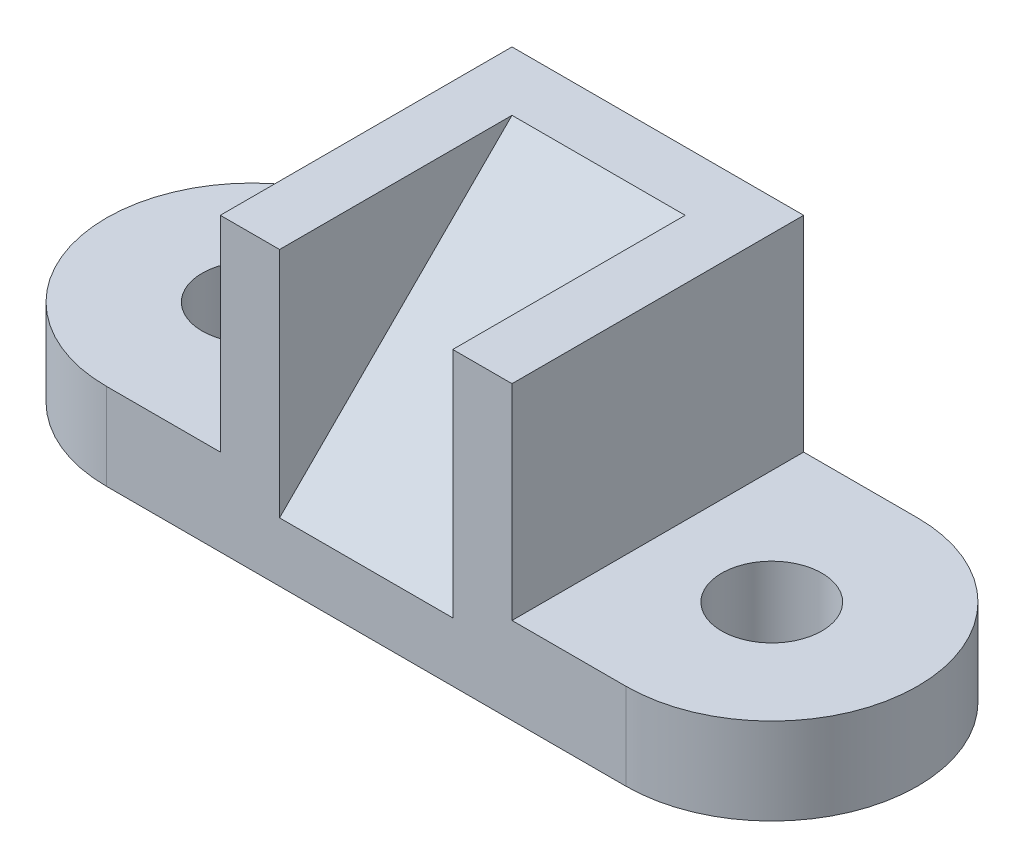
ISO-10303-21;
HEADER;
FILE_DESCRIPTION(('STEP AP214'),'2;1');
FILE_NAME('part.step','',(''),(''),'','','');
FILE_SCHEMA(('AUTOMOTIVE_DESIGN { 1 0 10303 214 1 1 1 1 }'));
ENDSEC;
DATA;
#1=APPLICATION_CONTEXT('core data for automotive mechanical design processes');
#2=APPLICATION_PROTOCOL_DEFINITION('international standard','automotive_design',2000,#1);
#3=PRODUCT_CONTEXT('',#1,'mechanical');
#4=PRODUCT('Part','Part','',(#3));
#5=PRODUCT_RELATED_PRODUCT_CATEGORY('part','',(#4));
#6=PRODUCT_DEFINITION_FORMATION('','',#4);
#7=PRODUCT_DEFINITION_CONTEXT('part definition',#1,'design');
#8=PRODUCT_DEFINITION('design','',#6,#7);
#9=PRODUCT_DEFINITION_SHAPE('','',#8);
#10=(LENGTH_UNIT() NAMED_UNIT(*) SI_UNIT(.MILLI.,.METRE.));
#11=(NAMED_UNIT(*) PLANE_ANGLE_UNIT() SI_UNIT($,.RADIAN.));
#12=(NAMED_UNIT(*) SI_UNIT($,.STERADIAN.) SOLID_ANGLE_UNIT());
#13=UNCERTAINTY_MEASURE_WITH_UNIT(LENGTH_MEASURE(1.E-05),#10,'distance_accuracy_value','');
#14=(GEOMETRIC_REPRESENTATION_CONTEXT(3) GLOBAL_UNCERTAINTY_ASSIGNED_CONTEXT((#13)) GLOBAL_UNIT_ASSIGNED_CONTEXT((#10,
#11,#12)) REPRESENTATION_CONTEXT('',''));
#15=CARTESIAN_POINT('',(0.,0.,0.));
#16=DIRECTION('',(0.,0.,1.));
#17=DIRECTION('',(1.,0.,0.));
#18=AXIS2_PLACEMENT_3D('',#15,#16,#17);
#19=CARTESIAN_POINT('',(0.,19.,32.));
#20=DIRECTION('',(0.,0.,-1.));
#21=DIRECTION('',(-1.,0.,0.));
#22=AXIS2_PLACEMENT_3D('',#19,#20,#21);
#23=PLANE('',#22);
#24=DIRECTION('',(0.,1.,0.));
#25=VECTOR('',#24,1.);
#26=CARTESIAN_POINT('',(76.,13.,32.));
#27=LINE('',#26,#25);
#28=CARTESIAN_POINT('',(76.,13.,32.));
#29=VERTEX_POINT('',#28);
#30=CARTESIAN_POINT('',(76.,64.,32.));
#31=VERTEX_POINT('',#30);
#32=EDGE_CURVE('E122',#29,#31,#27,.T.);
#33=ORIENTED_EDGE('',*,*,#32,.F.);
#34=DIRECTION('',(-1.,0.,0.));
#35=VECTOR('',#34,1.);
#36=CARTESIAN_POINT('',(76.,13.,32.));
#37=LINE('',#36,#35);
#38=CARTESIAN_POINT('',(38.,13.,32.));
#39=VERTEX_POINT('',#38);
#40=EDGE_CURVE('E156',#29,#39,#37,.T.);
#41=ORIENTED_EDGE('',*,*,#40,.T.);
#42=DIRECTION('',(0.,1.,0.));
#43=VECTOR('',#42,1.);
#44=CARTESIAN_POINT('',(38.,13.,32.));
#45=LINE('',#44,#43);
#46=CARTESIAN_POINT('',(38.,64.,32.));
#47=VERTEX_POINT('',#46);
#48=EDGE_CURVE('E241',#39,#47,#45,.T.);
#49=ORIENTED_EDGE('',*,*,#48,.T.);
#50=DIRECTION('',(1.,0.,0.));
#51=VECTOR('',#50,1.);
#52=CARTESIAN_POINT('',(25.,64.,32.));
#53=LINE('',#52,#51);
#54=CARTESIAN_POINT('',(25.,64.,32.));
#55=VERTEX_POINT('',#54);
#56=EDGE_CURVE('E145',#55,#47,#53,.T.);
#57=ORIENTED_EDGE('',*,*,#56,.F.);
#58=DIRECTION('',(0.,-1.,0.));
#59=VECTOR('',#58,1.);
#60=CARTESIAN_POINT('',(25.,64.,32.));
#61=LINE('',#60,#59);
#62=CARTESIAN_POINT('',(25.,19.,32.));
#63=VERTEX_POINT('',#62);
#64=EDGE_CURVE('E160',#55,#63,#61,.T.);
#65=ORIENTED_EDGE('',*,*,#64,.T.);
#66=DIRECTION('',(1.,0.,0.));
#67=VECTOR('',#66,1.);
#68=CARTESIAN_POINT('',(0.,19.,32.));
#69=LINE('',#68,#67);
#70=CARTESIAN_POINT('',(0.,19.,32.));
#71=VERTEX_POINT('',#70);
#72=EDGE_CURVE('E187',#71,#63,#69,.T.);
#73=ORIENTED_EDGE('',*,*,#72,.F.);
#74=DIRECTION('',(0.,-1.,0.));
#75=VECTOR('',#74,1.);
#76=CARTESIAN_POINT('',(0.,19.,32.));
#77=LINE('',#76,#75);
#78=CARTESIAN_POINT('',(0.,0.,32.));
#79=VERTEX_POINT('',#78);
#80=EDGE_CURVE('E11',#71,#79,#77,.T.);
#81=ORIENTED_EDGE('',*,*,#80,.T.);
#82=DIRECTION('',(1.,0.,0.));
#83=VECTOR('',#82,1.);
#84=CARTESIAN_POINT('',(0.,0.,32.));
#85=LINE('',#84,#83);
#86=CARTESIAN_POINT('',(114.,0.,32.));
#87=VERTEX_POINT('',#86);
#88=EDGE_CURVE('E197',#79,#87,#85,.T.);
#89=ORIENTED_EDGE('',*,*,#88,.T.);
#90=DIRECTION('',(0.,-1.,0.));
#91=VECTOR('',#90,1.);
#92=CARTESIAN_POINT('',(114.,19.,32.));
#93=LINE('',#92,#91);
#94=CARTESIAN_POINT('',(114.,19.,32.));
#95=VERTEX_POINT('',#94);
#96=EDGE_CURVE('E47',#95,#87,#93,.T.);
#97=ORIENTED_EDGE('',*,*,#96,.F.);
#98=CARTESIAN_POINT('',(89.,19.,32.));
#99=VERTEX_POINT('',#98);
#100=EDGE_CURVE('E185',#99,#95,#69,.T.);
#101=ORIENTED_EDGE('',*,*,#100,.F.);
#102=DIRECTION('',(0.,-1.,0.));
#103=VECTOR('',#102,1.);
#104=CARTESIAN_POINT('',(89.,64.,32.));
#105=LINE('',#104,#103);
#106=CARTESIAN_POINT('',(89.,64.,32.));
#107=VERTEX_POINT('',#106);
#108=EDGE_CURVE('E143',#107,#99,#105,.T.);
#109=ORIENTED_EDGE('',*,*,#108,.F.);
#110=EDGE_CURVE('E136',#31,#107,#53,.T.);
#111=ORIENTED_EDGE('',*,*,#110,.F.);
#112=EDGE_LOOP('',(#33,#41,#49,#57,#65,#73,#81,#89,#97,#101,#109,#111));
#113=FACE_BOUND('',#112,.T.);
#114=ADVANCED_FACE('F39',(#113),#23,.F.);
#115=CARTESIAN_POINT('',(0.,64.,0.));
#116=DIRECTION('',(0.,-1.,0.));
#117=DIRECTION('',(0.,0.,-1.));
#118=AXIS2_PLACEMENT_3D('',#115,#116,#117);
#119=PLANE('',#118);
#120=DIRECTION('',(0.,0.,-1.));
#121=VECTOR('',#120,1.);
#122=CARTESIAN_POINT('',(76.,64.,32.));
#123=LINE('',#122,#121);
#124=CARTESIAN_POINT('',(76.,64.,-19.));
#125=VERTEX_POINT('',#124);
#126=EDGE_CURVE('E125',#31,#125,#123,.T.);
#127=ORIENTED_EDGE('',*,*,#126,.F.);
#128=ORIENTED_EDGE('',*,*,#110,.T.);
#129=DIRECTION('',(0.,0.,-1.));
#130=VECTOR('',#129,1.);
#131=CARTESIAN_POINT('',(89.,64.,32.));
#132=LINE('',#131,#130);
#133=CARTESIAN_POINT('',(89.,64.,-32.));
#134=VERTEX_POINT('',#133);
#135=EDGE_CURVE('E158',#107,#134,#132,.T.);
#136=ORIENTED_EDGE('',*,*,#135,.T.);
#137=DIRECTION('',(-1.,0.,0.));
#138=VECTOR('',#137,1.);
#139=CARTESIAN_POINT('',(25.,64.,-32.));
#140=LINE('',#139,#138);
#141=CARTESIAN_POINT('',(25.,64.,-32.));
#142=VERTEX_POINT('',#141);
#143=EDGE_CURVE('E149',#134,#142,#140,.T.);
#144=ORIENTED_EDGE('',*,*,#143,.T.);
#145=DIRECTION('',(0.,0.,1.));
#146=VECTOR('',#145,1.);
#147=CARTESIAN_POINT('',(25.,64.,32.));
#148=LINE('',#147,#146);
#149=EDGE_CURVE('E146',#142,#55,#148,.T.);
#150=ORIENTED_EDGE('',*,*,#149,.T.);
#151=ORIENTED_EDGE('',*,*,#56,.T.);
#152=DIRECTION('',(0.,0.,-1.));
#153=VECTOR('',#152,1.);
#154=CARTESIAN_POINT('',(38.,64.,32.));
#155=LINE('',#154,#153);
#156=CARTESIAN_POINT('',(38.,64.,-19.));
#157=VERTEX_POINT('',#156);
#158=EDGE_CURVE('E239',#47,#157,#155,.T.);
#159=ORIENTED_EDGE('',*,*,#158,.T.);
#160=DIRECTION('',(-1.,0.,0.));
#161=VECTOR('',#160,1.);
#162=CARTESIAN_POINT('',(76.,64.,-19.));
#163=LINE('',#162,#161);
#164=EDGE_CURVE('E139',#125,#157,#163,.T.);
#165=ORIENTED_EDGE('',*,*,#164,.F.);
#166=EDGE_LOOP('',(#127,#128,#136,#144,#150,#151,#159,#165));
#167=FACE_BOUND('',#166,.T.);
#168=ADVANCED_FACE('F134',(#167),#119,.F.);
#169=CARTESIAN_POINT('',(0.,19.,0.));
#170=DIRECTION('',(0.,1.,0.));
#171=DIRECTION('',(0.,0.,1.));
#172=AXIS2_PLACEMENT_3D('',#169,#170,#171);
#173=PLANE('',#172);
#174=DIRECTION('',(0.,0.,-1.));
#175=VECTOR('',#174,1.);
#176=CARTESIAN_POINT('',(89.,19.,32.));
#177=LINE('',#176,#175);
#178=CARTESIAN_POINT('',(89.,19.,-32.));
#179=VERTEX_POINT('',#178);
#180=EDGE_CURVE('E153',#99,#179,#177,.T.);
#181=ORIENTED_EDGE('',*,*,#180,.F.);
#182=ORIENTED_EDGE('',*,*,#100,.T.);
#183=CARTESIAN_POINT('',(114.,19.,0.));
#184=DIRECTION('',(0.,1.,0.));
#185=DIRECTION('',(0.,0.,1.));
#186=AXIS2_PLACEMENT_3D('',#183,#184,#185);
#187=CIRCLE('',#186,32.);
#188=CARTESIAN_POINT('',(114.,19.,-32.));
#189=VERTEX_POINT('',#188);
#190=EDGE_CURVE('E189',#95,#189,#187,.T.);
#191=ORIENTED_EDGE('',*,*,#190,.T.);
#192=DIRECTION('',(-1.,0.,0.));
#193=VECTOR('',#192,1.);
#194=CARTESIAN_POINT('',(0.,19.,-32.));
#195=LINE('',#194,#193);
#196=EDGE_CURVE('E192',#189,#179,#195,.T.);
#197=ORIENTED_EDGE('',*,*,#196,.T.);
#198=EDGE_LOOP('',(#181,#182,#191,#197));
#199=FACE_BOUND('',#198,.T.);
#200=CARTESIAN_POINT('',(114.,19.,0.));
#201=DIRECTION('',(0.,1.,0.));
#202=DIRECTION('',(0.,0.,1.));
#203=AXIS2_PLACEMENT_3D('',#200,#201,#202);
#204=CIRCLE('',#203,11.);
#205=CARTESIAN_POINT('',(114.,19.,11.));
#206=VERTEX_POINT('',#205);
#207=EDGE_CURVE('E170',#206,#206,#204,.T.);
#208=ORIENTED_EDGE('',*,*,#207,.F.);
#209=EDGE_LOOP('',(#208));
#210=FACE_BOUND('',#209,.T.);
#211=ADVANCED_FACE('F262',(#199,#210),#173,.T.);
#212=DIRECTION('',(0.,0.,1.));
#213=VECTOR('',#212,1.);
#214=CARTESIAN_POINT('',(25.,19.,32.));
#215=LINE('',#214,#213);
#216=CARTESIAN_POINT('',(25.,19.,-32.));
#217=VERTEX_POINT('',#216);
#218=EDGE_CURVE('E62',#217,#63,#215,.T.);
#219=ORIENTED_EDGE('',*,*,#218,.F.);
#220=CARTESIAN_POINT('',(0.,19.,-32.));
#221=VERTEX_POINT('',#220);
#222=EDGE_CURVE('E191',#217,#221,#195,.T.);
#223=ORIENTED_EDGE('',*,*,#222,.T.);
#224=CARTESIAN_POINT('',(0.,19.,0.));
#225=DIRECTION('',(0.,1.,0.));
#226=DIRECTION('',(0.,0.,1.));
#227=AXIS2_PLACEMENT_3D('',#224,#225,#226);
#228=CIRCLE('',#227,32.);
#229=EDGE_CURVE('E182',#221,#71,#228,.T.);
#230=ORIENTED_EDGE('',*,*,#229,.T.);
#231=ORIENTED_EDGE('',*,*,#72,.T.);
#232=EDGE_LOOP('',(#219,#223,#230,#231));
#233=FACE_BOUND('',#232,.T.);
#234=CARTESIAN_POINT('',(0.,19.,0.));
#235=DIRECTION('',(0.,1.,0.));
#236=DIRECTION('',(0.,0.,1.));
#237=AXIS2_PLACEMENT_3D('',#234,#235,#236);
#238=CIRCLE('',#237,11.);
#239=CARTESIAN_POINT('',(0.,19.,11.));
#240=VERTEX_POINT('',#239);
#241=EDGE_CURVE('E176',#240,#240,#238,.T.);
#242=ORIENTED_EDGE('',*,*,#241,.F.);
#243=EDGE_LOOP('',(#242));
#244=FACE_BOUND('',#243,.T.);
#245=ADVANCED_FACE('F225',(#233,#244),#173,.T.);
#246=CARTESIAN_POINT('',(0.,0.,0.));
#247=DIRECTION('',(0.,1.,0.));
#248=DIRECTION('',(0.,0.,1.));
#249=AXIS2_PLACEMENT_3D('',#246,#247,#248);
#250=PLANE('',#249);
#251=CARTESIAN_POINT('',(0.,0.,0.));
#252=DIRECTION('',(0.,1.,0.));
#253=DIRECTION('',(0.,0.,1.));
#254=AXIS2_PLACEMENT_3D('',#251,#252,#253);
#255=CIRCLE('',#254,32.);
#256=CARTESIAN_POINT('',(0.,0.,-32.));
#257=VERTEX_POINT('',#256);
#258=EDGE_CURVE('E179',#257,#79,#255,.T.);
#259=ORIENTED_EDGE('',*,*,#258,.F.);
#260=DIRECTION('',(-1.,0.,0.));
#261=VECTOR('',#260,1.);
#262=CARTESIAN_POINT('',(0.,0.,-32.));
#263=LINE('',#262,#261);
#264=CARTESIAN_POINT('',(114.,0.,-32.));
#265=VERTEX_POINT('',#264);
#266=EDGE_CURVE('E186',#265,#257,#263,.T.);
#267=ORIENTED_EDGE('',*,*,#266,.F.);
#268=CARTESIAN_POINT('',(114.,0.,0.));
#269=DIRECTION('',(0.,1.,0.));
#270=DIRECTION('',(0.,0.,1.));
#271=AXIS2_PLACEMENT_3D('',#268,#269,#270);
#272=CIRCLE('',#271,32.);
#273=EDGE_CURVE('E199',#87,#265,#272,.T.);
#274=ORIENTED_EDGE('',*,*,#273,.F.);
#275=ORIENTED_EDGE('',*,*,#88,.F.);
#276=EDGE_LOOP('',(#259,#267,#274,#275));
#277=FACE_BOUND('',#276,.T.);
#278=CARTESIAN_POINT('',(0.,0.,0.));
#279=DIRECTION('',(0.,1.,0.));
#280=DIRECTION('',(0.,0.,1.));
#281=AXIS2_PLACEMENT_3D('',#278,#279,#280);
#282=CIRCLE('',#281,11.);
#283=CARTESIAN_POINT('',(0.,0.,11.));
#284=VERTEX_POINT('',#283);
#285=EDGE_CURVE('E173',#284,#284,#282,.T.);
#286=ORIENTED_EDGE('',*,*,#285,.T.);
#287=EDGE_LOOP('',(#286));
#288=FACE_BOUND('',#287,.T.);
#289=CARTESIAN_POINT('',(114.,0.,0.));
#290=DIRECTION('',(0.,1.,0.));
#291=DIRECTION('',(0.,0.,1.));
#292=AXIS2_PLACEMENT_3D('',#289,#290,#291);
#293=CIRCLE('',#292,11.);
#294=CARTESIAN_POINT('',(114.,0.,11.));
#295=VERTEX_POINT('',#294);
#296=EDGE_CURVE('E169',#295,#295,#293,.T.);
#297=ORIENTED_EDGE('',*,*,#296,.T.);
#298=EDGE_LOOP('',(#297));
#299=FACE_BOUND('',#298,.T.);
#300=ADVANCED_FACE('F216',(#277,#288,#299),#250,.F.);
#301=CARTESIAN_POINT('',(0.,19.,0.));
#302=DIRECTION('',(0.,-1.,0.));
#303=DIRECTION('',(0.,0.,-1.));
#304=AXIS2_PLACEMENT_3D('',#301,#302,#303);
#305=CYLINDRICAL_SURFACE('',#304,32.);
#306=ORIENTED_EDGE('',*,*,#258,.T.);
#307=ORIENTED_EDGE('',*,*,#80,.F.);
#308=ORIENTED_EDGE('',*,*,#229,.F.);
#309=DIRECTION('',(0.,-1.,0.));
#310=VECTOR('',#309,1.);
#311=CARTESIAN_POINT('',(0.,19.,-32.));
#312=LINE('',#311,#310);
#313=EDGE_CURVE('E194',#221,#257,#312,.T.);
#314=ORIENTED_EDGE('',*,*,#313,.T.);
#315=EDGE_LOOP('',(#306,#307,#308,#314));
#316=FACE_BOUND('',#315,.T.);
#317=ADVANCED_FACE('F41',(#316),#305,.T.);
#318=CARTESIAN_POINT('',(114.,19.,0.));
#319=DIRECTION('',(0.,-1.,0.));
#320=DIRECTION('',(0.,0.,-1.));
#321=AXIS2_PLACEMENT_3D('',#318,#319,#320);
#322=CYLINDRICAL_SURFACE('',#321,32.);
#323=ORIENTED_EDGE('',*,*,#273,.T.);
#324=DIRECTION('',(0.,-1.,0.));
#325=VECTOR('',#324,1.);
#326=CARTESIAN_POINT('',(114.,19.,-32.));
#327=LINE('',#326,#325);
#328=EDGE_CURVE('E204',#189,#265,#327,.T.);
#329=ORIENTED_EDGE('',*,*,#328,.F.);
#330=ORIENTED_EDGE('',*,*,#190,.F.);
#331=ORIENTED_EDGE('',*,*,#96,.T.);
#332=EDGE_LOOP('',(#323,#329,#330,#331));
#333=FACE_BOUND('',#332,.T.);
#334=ADVANCED_FACE('F211',(#333),#322,.T.);
#335=CARTESIAN_POINT('',(0.,19.,-32.));
#336=DIRECTION('',(0.,0.,1.));
#337=DIRECTION('',(1.,0.,0.));
#338=AXIS2_PLACEMENT_3D('',#335,#336,#337);
#339=PLANE('',#338);
#340=ORIENTED_EDGE('',*,*,#266,.T.);
#341=ORIENTED_EDGE('',*,*,#313,.F.);
#342=ORIENTED_EDGE('',*,*,#222,.F.);
#343=DIRECTION('',(0.,-1.,0.));
#344=VECTOR('',#343,1.);
#345=CARTESIAN_POINT('',(25.,64.,-32.));
#346=LINE('',#345,#344);
#347=EDGE_CURVE('E163',#142,#217,#346,.T.);
#348=ORIENTED_EDGE('',*,*,#347,.F.);
#349=ORIENTED_EDGE('',*,*,#143,.F.);
#350=DIRECTION('',(0.,-1.,0.));
#351=VECTOR('',#350,1.);
#352=CARTESIAN_POINT('',(89.,64.,-32.));
#353=LINE('',#352,#351);
#354=EDGE_CURVE('E166',#134,#179,#353,.T.);
#355=ORIENTED_EDGE('',*,*,#354,.T.);
#356=ORIENTED_EDGE('',*,*,#196,.F.);
#357=ORIENTED_EDGE('',*,*,#328,.T.);
#358=EDGE_LOOP('',(#340,#341,#342,#348,#349,#355,#356,#357));
#359=FACE_BOUND('',#358,.T.);
#360=ADVANCED_FACE('F220',(#359),#339,.F.);
#361=CARTESIAN_POINT('',(0.,19.,0.));
#362=DIRECTION('',(0.,-1.,0.));
#363=DIRECTION('',(0.,0.,-1.));
#364=AXIS2_PLACEMENT_3D('',#361,#362,#363);
#365=CYLINDRICAL_SURFACE('',#364,11.);
#366=ORIENTED_EDGE('',*,*,#241,.T.);
#367=EDGE_LOOP('',(#366));
#368=FACE_BOUND('',#367,.T.);
#369=ORIENTED_EDGE('',*,*,#285,.F.);
#370=EDGE_LOOP('',(#369));
#371=FACE_BOUND('',#370,.T.);
#372=ADVANCED_FACE('F268',(#368,#371),#365,.F.);
#373=CARTESIAN_POINT('',(114.,19.,0.));
#374=DIRECTION('',(0.,-1.,0.));
#375=DIRECTION('',(0.,0.,-1.));
#376=AXIS2_PLACEMENT_3D('',#373,#374,#375);
#377=CYLINDRICAL_SURFACE('',#376,11.);
#378=ORIENTED_EDGE('',*,*,#207,.T.);
#379=EDGE_LOOP('',(#378));
#380=FACE_BOUND('',#379,.T.);
#381=ORIENTED_EDGE('',*,*,#296,.F.);
#382=EDGE_LOOP('',(#381));
#383=FACE_BOUND('',#382,.T.);
#384=ADVANCED_FACE('F275',(#380,#383),#377,.F.);
#385=CARTESIAN_POINT('',(89.,64.,32.));
#386=DIRECTION('',(-1.,0.,0.));
#387=DIRECTION('',(0.,0.,1.));
#388=AXIS2_PLACEMENT_3D('',#385,#386,#387);
#389=PLANE('',#388);
#390=ORIENTED_EDGE('',*,*,#180,.T.);
#391=ORIENTED_EDGE('',*,*,#354,.F.);
#392=ORIENTED_EDGE('',*,*,#135,.F.);
#393=ORIENTED_EDGE('',*,*,#108,.T.);
#394=EDGE_LOOP('',(#390,#391,#392,#393));
#395=FACE_BOUND('',#394,.T.);
#396=ADVANCED_FACE('F255',(#395),#389,.F.);
#397=CARTESIAN_POINT('',(25.,64.,32.));
#398=DIRECTION('',(1.,0.,0.));
#399=DIRECTION('',(0.,0.,-1.));
#400=AXIS2_PLACEMENT_3D('',#397,#398,#399);
#401=PLANE('',#400);
#402=ORIENTED_EDGE('',*,*,#218,.T.);
#403=ORIENTED_EDGE('',*,*,#64,.F.);
#404=ORIENTED_EDGE('',*,*,#149,.F.);
#405=ORIENTED_EDGE('',*,*,#347,.T.);
#406=EDGE_LOOP('',(#402,#403,#404,#405));
#407=FACE_BOUND('',#406,.T.);
#408=ADVANCED_FACE('F230',(#407),#401,.F.);
#409=CARTESIAN_POINT('',(76.,64.,-19.));
#410=DIRECTION('',(0.,-0.707106781186548,-0.707106781186548));
#411=DIRECTION('',(0.,0.707106781186548,-0.707106781186548));
#412=AXIS2_PLACEMENT_3D('',#409,#410,#411);
#413=PLANE('',#412);
#414=DIRECTION('',(0.,-0.707106781186548,0.707106781186547));
#415=VECTOR('',#414,1.);
#416=CARTESIAN_POINT('',(38.,64.,-19.));
#417=LINE('',#416,#415);
#418=EDGE_CURVE('E54',#157,#39,#417,.T.);
#419=ORIENTED_EDGE('',*,*,#418,.T.);
#420=ORIENTED_EDGE('',*,*,#40,.F.);
#421=DIRECTION('',(0.,-0.707106781186548,0.707106781186547));
#422=VECTOR('',#421,1.);
#423=CARTESIAN_POINT('',(76.,64.,-19.));
#424=LINE('',#423,#422);
#425=EDGE_CURVE('E127',#125,#29,#424,.T.);
#426=ORIENTED_EDGE('',*,*,#425,.F.);
#427=ORIENTED_EDGE('',*,*,#164,.T.);
#428=EDGE_LOOP('',(#419,#420,#426,#427));
#429=FACE_BOUND('',#428,.T.);
#430=ADVANCED_FACE('F246',(#429),#413,.F.);
#431=CARTESIAN_POINT('',(76.,0.,0.));
#432=DIRECTION('',(-1.,0.,0.));
#433=DIRECTION('',(0.,0.,1.));
#434=AXIS2_PLACEMENT_3D('',#431,#432,#433);
#435=PLANE('',#434);
#436=ORIENTED_EDGE('',*,*,#32,.T.);
#437=ORIENTED_EDGE('',*,*,#126,.T.);
#438=ORIENTED_EDGE('',*,*,#425,.T.);
#439=EDGE_LOOP('',(#436,#437,#438));
#440=FACE_BOUND('',#439,.T.);
#441=ADVANCED_FACE('F124',(#440),#435,.T.);
#442=CARTESIAN_POINT('',(38.,0.,0.));
#443=DIRECTION('',(-1.,0.,0.));
#444=DIRECTION('',(0.,0.,1.));
#445=AXIS2_PLACEMENT_3D('',#442,#443,#444);
#446=PLANE('',#445);
#447=ORIENTED_EDGE('',*,*,#48,.F.);
#448=ORIENTED_EDGE('',*,*,#418,.F.);
#449=ORIENTED_EDGE('',*,*,#158,.F.);
#450=EDGE_LOOP('',(#447,#448,#449));
#451=FACE_BOUND('',#450,.T.);
#452=ADVANCED_FACE('F244',(#451),#446,.F.);
#453=CLOSED_SHELL('',(#114,#168,#211,#245,#300,#317,#334,#360,#372,#384,#396,#408,#430,#441,#452));
#454=MANIFOLD_SOLID_BREP('B2',#453);
#455=ADVANCED_BREP_SHAPE_REPRESENTATION('',(#18,#454),#14);
#456=SHAPE_DEFINITION_REPRESENTATION(#9,#455);
ENDSEC;
END-ISO-10303-21;
